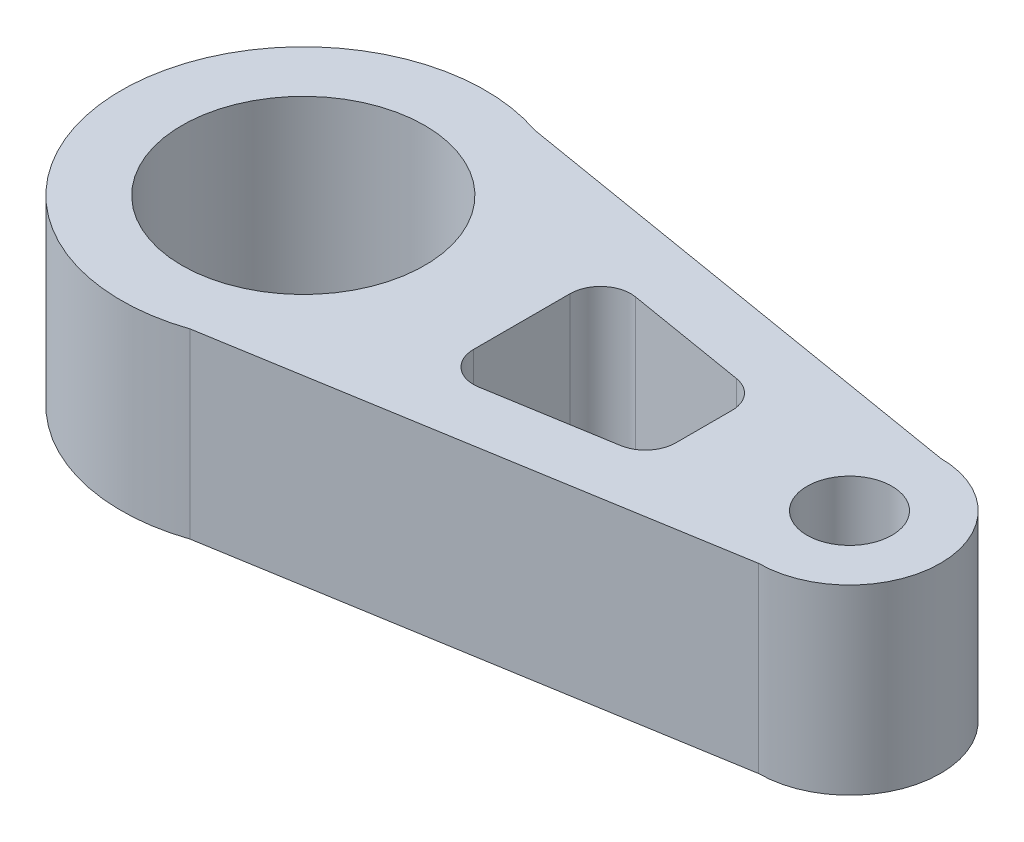
ISO-10303-21;
HEADER;
FILE_DESCRIPTION(('STEP AP214'),'2;1');
FILE_NAME('part.step','',(''),(''),'','','');
FILE_SCHEMA(('AUTOMOTIVE_DESIGN { 1 0 10303 214 1 1 1 1 }'));
ENDSEC;
DATA;
#1=APPLICATION_CONTEXT('core data for automotive mechanical design processes');
#2=APPLICATION_PROTOCOL_DEFINITION('international standard','automotive_design',2000,#1);
#3=PRODUCT_CONTEXT('',#1,'mechanical');
#4=PRODUCT('Part','Part','',(#3));
#5=PRODUCT_RELATED_PRODUCT_CATEGORY('part','',(#4));
#6=PRODUCT_DEFINITION_FORMATION('','',#4);
#7=PRODUCT_DEFINITION_CONTEXT('part definition',#1,'design');
#8=PRODUCT_DEFINITION('design','',#6,#7);
#9=PRODUCT_DEFINITION_SHAPE('','',#8);
#10=(LENGTH_UNIT() NAMED_UNIT(*) SI_UNIT(.MILLI.,.METRE.));
#11=(NAMED_UNIT(*) PLANE_ANGLE_UNIT() SI_UNIT($,.RADIAN.));
#12=(NAMED_UNIT(*) SI_UNIT($,.STERADIAN.) SOLID_ANGLE_UNIT());
#13=UNCERTAINTY_MEASURE_WITH_UNIT(LENGTH_MEASURE(1.E-05),#10,'distance_accuracy_value','');
#14=(GEOMETRIC_REPRESENTATION_CONTEXT(3) GLOBAL_UNCERTAINTY_ASSIGNED_CONTEXT((#13)) GLOBAL_UNIT_ASSIGNED_CONTEXT((#10,
#11,#12)) REPRESENTATION_CONTEXT('',''));
#15=CARTESIAN_POINT('',(0.,0.,0.));
#16=DIRECTION('',(0.,0.,1.));
#17=DIRECTION('',(1.,0.,0.));
#18=AXIS2_PLACEMENT_3D('',#15,#16,#17);
#19=CARTESIAN_POINT('',(57.15,19.05,0.));
#20=DIRECTION('',(0.,-1.,0.));
#21=DIRECTION('',(0.,0.,-1.));
#22=AXIS2_PLACEMENT_3D('',#19,#20,#21);
#23=CYLINDRICAL_SURFACE('',#22,4.445);
#24=CARTESIAN_POINT('',(57.15,19.05,0.));
#25=DIRECTION('',(0.,1.,0.));
#26=DIRECTION('',(0.,0.,1.));
#27=AXIS2_PLACEMENT_3D('',#24,#25,#26);
#28=CIRCLE('',#27,4.445);
#29=CARTESIAN_POINT('',(57.15,19.05,4.445));
#30=VERTEX_POINT('',#29);
#31=EDGE_CURVE('E201',#30,#30,#28,.T.);
#32=ORIENTED_EDGE('',*,*,#31,.T.);
#33=EDGE_LOOP('',(#32));
#34=FACE_BOUND('',#33,.T.);
#35=CARTESIAN_POINT('',(57.15,0.,0.));
#36=DIRECTION('',(0.,1.,0.));
#37=DIRECTION('',(0.,0.,1.));
#38=AXIS2_PLACEMENT_3D('',#35,#36,#37);
#39=CIRCLE('',#38,4.445);
#40=CARTESIAN_POINT('',(57.15,0.,4.445));
#41=VERTEX_POINT('',#40);
#42=EDGE_CURVE('E238',#41,#41,#39,.T.);
#43=ORIENTED_EDGE('',*,*,#42,.F.);
#44=EDGE_LOOP('',(#43));
#45=FACE_BOUND('',#44,.T.);
#46=ADVANCED_FACE('F73',(#34,#45),#23,.F.);
#47=CARTESIAN_POINT('',(3.08918918918919,19.05,18.5351351351351));
#48=DIRECTION('',(-0.164398987305357,0.,-0.986393923832144));
#49=DIRECTION('',(-0.986393923832144,0.,0.164398987305357));
#50=AXIS2_PLACEMENT_3D('',#47,#48,#49);
#51=PLANE('',#50);
#52=DIRECTION('',(0.986393923832144,0.,-0.164398987305357));
#53=VECTOR('',#52,1.);
#54=CARTESIAN_POINT('',(3.08918918918919,0.,18.5351351351351));
#55=LINE('',#54,#53);
#56=CARTESIAN_POINT('',(6.17837837837837,0.,18.0202702702703));
#57=VERTEX_POINT('',#56);
#58=CARTESIAN_POINT('',(57.15,0.,9.52499999999999));
#59=VERTEX_POINT('',#58);
#60=EDGE_CURVE('E193',#57,#59,#55,.T.);
#61=ORIENTED_EDGE('',*,*,#60,.T.);
#62=DIRECTION('',(0.,-1.,0.));
#63=VECTOR('',#62,1.);
#64=CARTESIAN_POINT('',(57.15,19.05,9.52499999999999));
#65=LINE('',#64,#63);
#66=CARTESIAN_POINT('',(57.15,19.05,9.52499999999999));
#67=VERTEX_POINT('',#66);
#68=EDGE_CURVE('E83',#67,#59,#65,.T.);
#69=ORIENTED_EDGE('',*,*,#68,.F.);
#70=DIRECTION('',(0.986393923832144,0.,-0.164398987305357));
#71=VECTOR('',#70,1.);
#72=CARTESIAN_POINT('',(3.08918918918919,19.05,18.5351351351351));
#73=LINE('',#72,#71);
#74=CARTESIAN_POINT('',(6.17837837837837,19.05,18.0202702702703));
#75=VERTEX_POINT('',#74);
#76=EDGE_CURVE('E181',#75,#67,#73,.T.);
#77=ORIENTED_EDGE('',*,*,#76,.F.);
#78=DIRECTION('',(0.,-1.,0.));
#79=VECTOR('',#78,1.);
#80=CARTESIAN_POINT('',(6.17837837837837,19.05,18.0202702702703));
#81=LINE('',#80,#79);
#82=EDGE_CURVE('E12',#75,#57,#81,.T.);
#83=ORIENTED_EDGE('',*,*,#82,.T.);
#84=EDGE_LOOP('',(#61,#69,#77,#83));
#85=FACE_BOUND('',#84,.T.);
#86=ADVANCED_FACE('F191',(#85),#51,.F.);
#87=CARTESIAN_POINT('',(57.15,19.05,0.));
#88=DIRECTION('',(0.,-1.,0.));
#89=DIRECTION('',(0.,0.,-1.));
#90=AXIS2_PLACEMENT_3D('',#87,#88,#89);
#91=CYLINDRICAL_SURFACE('',#90,9.52499999999999);
#92=CARTESIAN_POINT('',(57.15,0.,0.));
#93=DIRECTION('',(0.,1.,0.));
#94=DIRECTION('',(0.,0.,1.));
#95=AXIS2_PLACEMENT_3D('',#92,#93,#94);
#96=CIRCLE('',#95,9.52499999999999);
#97=CARTESIAN_POINT('',(57.15,0.,-9.52499999999999));
#98=VERTEX_POINT('',#97);
#99=EDGE_CURVE('E228',#59,#98,#96,.T.);
#100=ORIENTED_EDGE('',*,*,#99,.T.);
#101=DIRECTION('',(0.,-1.,0.));
#102=VECTOR('',#101,1.);
#103=CARTESIAN_POINT('',(57.15,19.05,-9.52499999999999));
#104=LINE('',#103,#102);
#105=CARTESIAN_POINT('',(57.15,19.05,-9.52499999999999));
#106=VERTEX_POINT('',#105);
#107=EDGE_CURVE('E177',#106,#98,#104,.T.);
#108=ORIENTED_EDGE('',*,*,#107,.F.);
#109=CARTESIAN_POINT('',(57.15,19.05,0.));
#110=DIRECTION('',(0.,1.,0.));
#111=DIRECTION('',(0.,0.,1.));
#112=AXIS2_PLACEMENT_3D('',#109,#110,#111);
#113=CIRCLE('',#112,9.52499999999999);
#114=EDGE_CURVE('E171',#67,#106,#113,.T.);
#115=ORIENTED_EDGE('',*,*,#114,.F.);
#116=ORIENTED_EDGE('',*,*,#68,.T.);
#117=EDGE_LOOP('',(#100,#108,#115,#116));
#118=FACE_BOUND('',#117,.T.);
#119=ADVANCED_FACE('F174',(#118),#91,.T.);
#120=CARTESIAN_POINT('',(3.08918918918919,19.05,-18.5351351351351));
#121=DIRECTION('',(-0.164398987305357,0.,0.986393923832144));
#122=DIRECTION('',(0.986393923832144,0.,0.164398987305357));
#123=AXIS2_PLACEMENT_3D('',#120,#121,#122);
#124=PLANE('',#123);
#125=DIRECTION('',(-0.986393923832144,0.,-0.164398987305357));
#126=VECTOR('',#125,1.);
#127=CARTESIAN_POINT('',(3.08918918918919,0.,-18.5351351351351));
#128=LINE('',#127,#126);
#129=CARTESIAN_POINT('',(6.17837837837837,0.,-18.0202702702703));
#130=VERTEX_POINT('',#129);
#131=EDGE_CURVE('E130',#98,#130,#128,.T.);
#132=ORIENTED_EDGE('',*,*,#131,.T.);
#133=DIRECTION('',(0.,-1.,0.));
#134=VECTOR('',#133,1.);
#135=CARTESIAN_POINT('',(6.17837837837837,19.05,-18.0202702702703));
#136=LINE('',#135,#134);
#137=CARTESIAN_POINT('',(6.17837837837837,19.05,-18.0202702702703));
#138=VERTEX_POINT('',#137);
#139=EDGE_CURVE('E92',#138,#130,#136,.T.);
#140=ORIENTED_EDGE('',*,*,#139,.F.);
#141=DIRECTION('',(-0.986393923832144,0.,-0.164398987305357));
#142=VECTOR('',#141,1.);
#143=CARTESIAN_POINT('',(3.08918918918919,19.05,-18.5351351351351));
#144=LINE('',#143,#142);
#145=EDGE_CURVE('E180',#106,#138,#144,.T.);
#146=ORIENTED_EDGE('',*,*,#145,.F.);
#147=ORIENTED_EDGE('',*,*,#107,.T.);
#148=EDGE_LOOP('',(#132,#140,#146,#147));
#149=FACE_BOUND('',#148,.T.);
#150=ADVANCED_FACE('F308',(#149),#124,.F.);
#151=CARTESIAN_POINT('',(41.91,19.05,0.));
#152=DIRECTION('',(1.,0.,0.));
#153=DIRECTION('',(0.,0.,-1.));
#154=AXIS2_PLACEMENT_3D('',#151,#152,#153);
#155=PLANE('',#154);
#156=DIRECTION('',(0.,0.,1.));
#157=VECTOR('',#156,1.);
#158=CARTESIAN_POINT('',(41.91,0.,0.));
#159=LINE('',#158,#157);
#160=CARTESIAN_POINT('',(41.91,0.,-2.93778114981824));
#161=VERTEX_POINT('',#160);
#162=CARTESIAN_POINT('',(41.91,0.,2.93778114981824));
#163=VERTEX_POINT('',#162);
#164=EDGE_CURVE('E224',#161,#163,#159,.T.);
#165=ORIENTED_EDGE('',*,*,#164,.T.);
#166=DIRECTION('',(0.,-1.,0.));
#167=VECTOR('',#166,1.);
#168=CARTESIAN_POINT('',(41.91,19.05,2.93778114981824));
#169=LINE('',#168,#167);
#170=CARTESIAN_POINT('',(41.91,19.05,2.93778114981824));
#171=VERTEX_POINT('',#170);
#172=EDGE_CURVE('E213',#171,#163,#169,.T.);
#173=ORIENTED_EDGE('',*,*,#172,.F.);
#174=DIRECTION('',(0.,0.,1.));
#175=VECTOR('',#174,1.);
#176=CARTESIAN_POINT('',(41.91,19.05,0.));
#177=LINE('',#176,#175);
#178=CARTESIAN_POINT('',(41.91,19.05,-2.93778114981824));
#179=VERTEX_POINT('',#178);
#180=EDGE_CURVE('E242',#179,#171,#177,.T.);
#181=ORIENTED_EDGE('',*,*,#180,.F.);
#182=DIRECTION('',(0.,-1.,0.));
#183=VECTOR('',#182,1.);
#184=CARTESIAN_POINT('',(41.91,19.05,-2.93778114981824));
#185=LINE('',#184,#183);
#186=EDGE_CURVE('E141',#179,#161,#185,.T.);
#187=ORIENTED_EDGE('',*,*,#186,.T.);
#188=EDGE_LOOP('',(#165,#173,#181,#187));
#189=FACE_BOUND('',#188,.T.);
#190=ADVANCED_FACE('F311',(#189),#155,.F.);
#191=CARTESIAN_POINT('',(38.735,19.05,2.93778114981824));
#192=DIRECTION('',(0.,-1.,0.));
#193=DIRECTION('',(0.,0.,-1.));
#194=AXIS2_PLACEMENT_3D('',#191,#192,#193);
#195=CYLINDRICAL_SURFACE('',#194,3.175);
#196=CARTESIAN_POINT('',(38.735,0.,2.93778114981824));
#197=DIRECTION('',(0.,1.,0.));
#198=DIRECTION('',(0.,0.,1.));
#199=AXIS2_PLACEMENT_3D('',#196,#197,#198);
#200=CIRCLE('',#199,3.175);
#201=CARTESIAN_POINT('',(39.2569667846945,0.,6.06958185798529));
#202=VERTEX_POINT('',#201);
#203=EDGE_CURVE('E264',#163,#202,#200,.F.);
#204=ORIENTED_EDGE('',*,*,#203,.T.);
#205=DIRECTION('',(0.,-1.,0.));
#206=VECTOR('',#205,1.);
#207=CARTESIAN_POINT('',(39.2569667846945,19.05,6.06958185798529));
#208=LINE('',#207,#206);
#209=CARTESIAN_POINT('',(39.2569667846945,19.05,6.06958185798529));
#210=VERTEX_POINT('',#209);
#211=EDGE_CURVE('E210',#210,#202,#208,.T.);
#212=ORIENTED_EDGE('',*,*,#211,.F.);
#213=CARTESIAN_POINT('',(38.735,19.05,2.93778114981824));
#214=DIRECTION('',(0.,1.,0.));
#215=DIRECTION('',(0.,0.,1.));
#216=AXIS2_PLACEMENT_3D('',#213,#214,#215);
#217=CIRCLE('',#216,3.175);
#218=EDGE_CURVE('E245',#171,#210,#217,.F.);
#219=ORIENTED_EDGE('',*,*,#218,.F.);
#220=ORIENTED_EDGE('',*,*,#172,.T.);
#221=EDGE_LOOP('',(#204,#212,#219,#220));
#222=FACE_BOUND('',#221,.T.);
#223=ADVANCED_FACE('F327',(#222),#195,.F.);
#224=CARTESIAN_POINT('',(2.04525561980018,19.05,12.271533718801));
#225=DIRECTION('',(0.164398987305358,0.,0.986393923832144));
#226=DIRECTION('',(0.986393923832144,0.,-0.164398987305358));
#227=AXIS2_PLACEMENT_3D('',#224,#225,#226);
#228=PLANE('',#227);
#229=DIRECTION('',(-0.986393923832144,0.,0.164398987305358));
#230=VECTOR('',#229,1.);
#231=CARTESIAN_POINT('',(2.04525561980018,0.,12.271533718801));
#232=LINE('',#231,#230);
#233=CARTESIAN_POINT('',(26.5569667846945,0.,8.18624852465197));
#234=VERTEX_POINT('',#233);
#235=EDGE_CURVE('E266',#202,#234,#232,.T.);
#236=ORIENTED_EDGE('',*,*,#235,.T.);
#237=DIRECTION('',(0.,-1.,0.));
#238=VECTOR('',#237,1.);
#239=CARTESIAN_POINT('',(26.5569667846945,19.05,8.18624852465197));
#240=LINE('',#239,#238);
#241=CARTESIAN_POINT('',(26.5569667846945,19.05,8.18624852465197));
#242=VERTEX_POINT('',#241);
#243=EDGE_CURVE('E208',#242,#234,#240,.T.);
#244=ORIENTED_EDGE('',*,*,#243,.F.);
#245=DIRECTION('',(-0.986393923832144,0.,0.164398987305358));
#246=VECTOR('',#245,1.);
#247=CARTESIAN_POINT('',(2.04525561980018,19.05,12.271533718801));
#248=LINE('',#247,#246);
#249=EDGE_CURVE('E249',#210,#242,#248,.T.);
#250=ORIENTED_EDGE('',*,*,#249,.F.);
#251=ORIENTED_EDGE('',*,*,#211,.T.);
#252=EDGE_LOOP('',(#236,#244,#250,#251));
#253=FACE_BOUND('',#252,.T.);
#254=ADVANCED_FACE('F323',(#253),#228,.F.);
#255=CARTESIAN_POINT('',(26.035,19.05,5.05444781648491));
#256=DIRECTION('',(0.,-1.,0.));
#257=DIRECTION('',(0.,0.,-1.));
#258=AXIS2_PLACEMENT_3D('',#255,#256,#257);
#259=CYLINDRICAL_SURFACE('',#258,3.175);
#260=CARTESIAN_POINT('',(26.035,0.,5.05444781648491));
#261=DIRECTION('',(0.,1.,0.));
#262=DIRECTION('',(0.,0.,1.));
#263=AXIS2_PLACEMENT_3D('',#260,#261,#262);
#264=CIRCLE('',#263,3.175);
#265=CARTESIAN_POINT('',(22.86,0.,5.05444781648491));
#266=VERTEX_POINT('',#265);
#267=EDGE_CURVE('E269',#266,#234,#264,.T.);
#268=ORIENTED_EDGE('',*,*,#267,.F.);
#269=DIRECTION('',(0.,-1.,0.));
#270=VECTOR('',#269,1.);
#271=CARTESIAN_POINT('',(22.86,19.05,5.05444781648491));
#272=LINE('',#271,#270);
#273=CARTESIAN_POINT('',(22.86,19.05,5.05444781648491));
#274=VERTEX_POINT('',#273);
#275=EDGE_CURVE('E206',#274,#266,#272,.T.);
#276=ORIENTED_EDGE('',*,*,#275,.F.);
#277=CARTESIAN_POINT('',(26.035,19.05,5.05444781648491));
#278=DIRECTION('',(0.,1.,0.));
#279=DIRECTION('',(0.,0.,1.));
#280=AXIS2_PLACEMENT_3D('',#277,#278,#279);
#281=CIRCLE('',#280,3.175);
#282=EDGE_CURVE('E251',#274,#242,#281,.T.);
#283=ORIENTED_EDGE('',*,*,#282,.T.);
#284=ORIENTED_EDGE('',*,*,#243,.T.);
#285=EDGE_LOOP('',(#268,#276,#283,#284));
#286=FACE_BOUND('',#285,.T.);
#287=ADVANCED_FACE('F319',(#286),#259,.F.);
#288=CARTESIAN_POINT('',(22.86,19.05,0.));
#289=DIRECTION('',(1.,0.,0.));
#290=DIRECTION('',(0.,0.,-1.));
#291=AXIS2_PLACEMENT_3D('',#288,#289,#290);
#292=PLANE('',#291);
#293=DIRECTION('',(0.,0.,1.));
#294=VECTOR('',#293,1.);
#295=CARTESIAN_POINT('',(22.86,0.,0.));
#296=LINE('',#295,#294);
#297=CARTESIAN_POINT('',(22.86,0.,-5.05444781648491));
#298=VERTEX_POINT('',#297);
#299=EDGE_CURVE('E272',#298,#266,#296,.T.);
#300=ORIENTED_EDGE('',*,*,#299,.F.);
#301=DIRECTION('',(0.,-1.,0.));
#302=VECTOR('',#301,1.);
#303=CARTESIAN_POINT('',(22.86,19.05,-5.05444781648491));
#304=LINE('',#303,#302);
#305=CARTESIAN_POINT('',(22.86,19.05,-5.05444781648491));
#306=VERTEX_POINT('',#305);
#307=EDGE_CURVE('E204',#306,#298,#304,.T.);
#308=ORIENTED_EDGE('',*,*,#307,.F.);
#309=DIRECTION('',(0.,0.,1.));
#310=VECTOR('',#309,1.);
#311=CARTESIAN_POINT('',(22.86,19.05,0.));
#312=LINE('',#311,#310);
#313=EDGE_CURVE('E254',#306,#274,#312,.T.);
#314=ORIENTED_EDGE('',*,*,#313,.T.);
#315=ORIENTED_EDGE('',*,*,#275,.T.);
#316=EDGE_LOOP('',(#300,#308,#314,#315));
#317=FACE_BOUND('',#316,.T.);
#318=ADVANCED_FACE('F316',(#317),#292,.T.);
#319=CARTESIAN_POINT('',(26.035,19.05,-5.05444781648491));
#320=DIRECTION('',(0.,-1.,0.));
#321=DIRECTION('',(0.,0.,-1.));
#322=AXIS2_PLACEMENT_3D('',#319,#320,#321);
#323=CYLINDRICAL_SURFACE('',#322,3.175);
#324=CARTESIAN_POINT('',(26.035,0.,-5.05444781648491));
#325=DIRECTION('',(0.,1.,0.));
#326=DIRECTION('',(0.,0.,1.));
#327=AXIS2_PLACEMENT_3D('',#324,#325,#326);
#328=CIRCLE('',#327,3.175);
#329=CARTESIAN_POINT('',(26.5569667846945,0.,-8.18624852465197));
#330=VERTEX_POINT('',#329);
#331=EDGE_CURVE('E233',#298,#330,#328,.F.);
#332=ORIENTED_EDGE('',*,*,#331,.T.);
#333=DIRECTION('',(0.,-1.,0.));
#334=VECTOR('',#333,1.);
#335=CARTESIAN_POINT('',(26.5569667846945,19.05,-8.18624852465197));
#336=LINE('',#335,#334);
#337=CARTESIAN_POINT('',(26.5569667846945,19.05,-8.18624852465197));
#338=VERTEX_POINT('',#337);
#339=EDGE_CURVE('E200',#338,#330,#336,.T.);
#340=ORIENTED_EDGE('',*,*,#339,.F.);
#341=CARTESIAN_POINT('',(26.035,19.05,-5.05444781648491));
#342=DIRECTION('',(0.,1.,0.));
#343=DIRECTION('',(0.,0.,1.));
#344=AXIS2_PLACEMENT_3D('',#341,#342,#343);
#345=CIRCLE('',#344,3.175);
#346=EDGE_CURVE('E257',#306,#338,#345,.F.);
#347=ORIENTED_EDGE('',*,*,#346,.F.);
#348=ORIENTED_EDGE('',*,*,#307,.T.);
#349=EDGE_LOOP('',(#332,#340,#347,#348));
#350=FACE_BOUND('',#349,.T.);
#351=ADVANCED_FACE('F277',(#350),#323,.F.);
#352=CARTESIAN_POINT('',(2.04525561980017,19.05,-12.271533718801));
#353=DIRECTION('',(0.164398987305357,0.,-0.986393923832144));
#354=DIRECTION('',(-0.986393923832144,0.,-0.164398987305357));
#355=AXIS2_PLACEMENT_3D('',#352,#353,#354);
#356=PLANE('',#355);
#357=DIRECTION('',(0.986393923832144,0.,0.164398987305357));
#358=VECTOR('',#357,1.);
#359=CARTESIAN_POINT('',(2.04525561980017,0.,-12.271533718801));
#360=LINE('',#359,#358);
#361=CARTESIAN_POINT('',(39.2569667846945,0.,-6.0695818579853));
#362=VERTEX_POINT('',#361);
#363=EDGE_CURVE('E229',#330,#362,#360,.T.);
#364=ORIENTED_EDGE('',*,*,#363,.T.);
#365=DIRECTION('',(0.,-1.,0.));
#366=VECTOR('',#365,1.);
#367=CARTESIAN_POINT('',(39.2569667846945,19.05,-6.0695818579853));
#368=LINE('',#367,#366);
#369=CARTESIAN_POINT('',(39.2569667846945,19.05,-6.0695818579853));
#370=VERTEX_POINT('',#369);
#371=EDGE_CURVE('E198',#370,#362,#368,.T.);
#372=ORIENTED_EDGE('',*,*,#371,.F.);
#373=DIRECTION('',(0.986393923832144,0.,0.164398987305357));
#374=VECTOR('',#373,1.);
#375=CARTESIAN_POINT('',(2.04525561980017,19.05,-12.271533718801));
#376=LINE('',#375,#374);
#377=EDGE_CURVE('E189',#338,#370,#376,.T.);
#378=ORIENTED_EDGE('',*,*,#377,.F.);
#379=ORIENTED_EDGE('',*,*,#339,.T.);
#380=EDGE_LOOP('',(#364,#372,#378,#379));
#381=FACE_BOUND('',#380,.T.);
#382=ADVANCED_FACE('F284',(#381),#356,.F.);
#383=CARTESIAN_POINT('',(38.735,19.05,-2.93778114981824));
#384=DIRECTION('',(0.,-1.,0.));
#385=DIRECTION('',(0.,0.,-1.));
#386=AXIS2_PLACEMENT_3D('',#383,#384,#385);
#387=CYLINDRICAL_SURFACE('',#386,3.175);
#388=CARTESIAN_POINT('',(38.735,0.,-2.93778114981824));
#389=DIRECTION('',(0.,1.,0.));
#390=DIRECTION('',(0.,0.,1.));
#391=AXIS2_PLACEMENT_3D('',#388,#389,#390);
#392=CIRCLE('',#391,3.175);
#393=EDGE_CURVE('E222',#161,#362,#392,.T.);
#394=ORIENTED_EDGE('',*,*,#393,.F.);
#395=ORIENTED_EDGE('',*,*,#186,.F.);
#396=CARTESIAN_POINT('',(38.735,19.05,-2.93778114981824));
#397=DIRECTION('',(0.,1.,0.));
#398=DIRECTION('',(0.,0.,1.));
#399=AXIS2_PLACEMENT_3D('',#396,#397,#398);
#400=CIRCLE('',#399,3.175);
#401=EDGE_CURVE('E240',#179,#370,#400,.T.);
#402=ORIENTED_EDGE('',*,*,#401,.T.);
#403=ORIENTED_EDGE('',*,*,#371,.T.);
#404=EDGE_LOOP('',(#394,#395,#402,#403));
#405=FACE_BOUND('',#404,.T.);
#406=ADVANCED_FACE('F288',(#405),#387,.F.);
#407=CARTESIAN_POINT('',(0.,0.,0.));
#408=DIRECTION('',(0.,1.,0.));
#409=DIRECTION('',(0.,0.,1.));
#410=AXIS2_PLACEMENT_3D('',#407,#408,#409);
#411=PLANE('',#410);
#412=ORIENTED_EDGE('',*,*,#393,.T.);
#413=ORIENTED_EDGE('',*,*,#363,.F.);
#414=ORIENTED_EDGE('',*,*,#331,.F.);
#415=ORIENTED_EDGE('',*,*,#299,.T.);
#416=ORIENTED_EDGE('',*,*,#267,.T.);
#417=ORIENTED_EDGE('',*,*,#235,.F.);
#418=ORIENTED_EDGE('',*,*,#203,.F.);
#419=ORIENTED_EDGE('',*,*,#164,.F.);
#420=EDGE_LOOP('',(#412,#413,#414,#415,#416,#417,#418,#419));
#421=FACE_BOUND('',#420,.T.);
#422=ORIENTED_EDGE('',*,*,#60,.F.);
#423=CARTESIAN_POINT('',(0.,0.,0.));
#424=DIRECTION('',(0.,1.,0.));
#425=DIRECTION('',(0.,0.,1.));
#426=AXIS2_PLACEMENT_3D('',#423,#424,#425);
#427=CIRCLE('',#426,19.05);
#428=EDGE_CURVE('E77',#130,#57,#427,.T.);
#429=ORIENTED_EDGE('',*,*,#428,.F.);
#430=ORIENTED_EDGE('',*,*,#131,.F.);
#431=ORIENTED_EDGE('',*,*,#99,.F.);
#432=EDGE_LOOP('',(#422,#429,#430,#431));
#433=FACE_BOUND('',#432,.T.);
#434=ORIENTED_EDGE('',*,*,#42,.T.);
#435=EDGE_LOOP('',(#434));
#436=FACE_BOUND('',#435,.T.);
#437=CARTESIAN_POINT('',(0.,0.,0.));
#438=DIRECTION('',(0.,1.,0.));
#439=DIRECTION('',(0.,0.,1.));
#440=AXIS2_PLACEMENT_3D('',#437,#438,#439);
#441=CIRCLE('',#440,12.7);
#442=CARTESIAN_POINT('',(0.,0.,12.7));
#443=VERTEX_POINT('',#442);
#444=EDGE_CURVE('E220',#443,#443,#441,.T.);
#445=ORIENTED_EDGE('',*,*,#444,.T.);
#446=EDGE_LOOP('',(#445));
#447=FACE_BOUND('',#446,.T.);
#448=ADVANCED_FACE('F226',(#421,#433,#436,#447),#411,.F.);
#449=CARTESIAN_POINT('',(0.,19.05,0.));
#450=DIRECTION('',(0.,1.,0.));
#451=DIRECTION('',(0.,0.,1.));
#452=AXIS2_PLACEMENT_3D('',#449,#450,#451);
#453=PLANE('',#452);
#454=ORIENTED_EDGE('',*,*,#401,.F.);
#455=ORIENTED_EDGE('',*,*,#180,.T.);
#456=ORIENTED_EDGE('',*,*,#218,.T.);
#457=ORIENTED_EDGE('',*,*,#249,.T.);
#458=ORIENTED_EDGE('',*,*,#282,.F.);
#459=ORIENTED_EDGE('',*,*,#313,.F.);
#460=ORIENTED_EDGE('',*,*,#346,.T.);
#461=ORIENTED_EDGE('',*,*,#377,.T.);
#462=EDGE_LOOP('',(#454,#455,#456,#457,#458,#459,#460,#461));
#463=FACE_BOUND('',#462,.T.);
#464=ORIENTED_EDGE('',*,*,#145,.T.);
#465=CARTESIAN_POINT('',(0.,19.05,0.));
#466=DIRECTION('',(0.,1.,0.));
#467=DIRECTION('',(0.,0.,1.));
#468=AXIS2_PLACEMENT_3D('',#465,#466,#467);
#469=CIRCLE('',#468,19.05);
#470=EDGE_CURVE('E187',#138,#75,#469,.T.);
#471=ORIENTED_EDGE('',*,*,#470,.T.);
#472=ORIENTED_EDGE('',*,*,#76,.T.);
#473=ORIENTED_EDGE('',*,*,#114,.T.);
#474=EDGE_LOOP('',(#464,#471,#472,#473));
#475=FACE_BOUND('',#474,.T.);
#476=ORIENTED_EDGE('',*,*,#31,.F.);
#477=EDGE_LOOP('',(#476));
#478=FACE_BOUND('',#477,.T.);
#479=CARTESIAN_POINT('',(0.,19.05,0.));
#480=DIRECTION('',(0.,1.,0.));
#481=DIRECTION('',(0.,0.,1.));
#482=AXIS2_PLACEMENT_3D('',#479,#480,#481);
#483=CIRCLE('',#482,12.7);
#484=CARTESIAN_POINT('',(0.,19.05,12.7));
#485=VERTEX_POINT('',#484);
#486=EDGE_CURVE('E217',#485,#485,#483,.T.);
#487=ORIENTED_EDGE('',*,*,#486,.F.);
#488=EDGE_LOOP('',(#487));
#489=FACE_BOUND('',#488,.T.);
#490=ADVANCED_FACE('F185',(#463,#475,#478,#489),#453,.T.);
#491=CARTESIAN_POINT('',(0.,19.05,0.));
#492=DIRECTION('',(0.,-1.,0.));
#493=DIRECTION('',(0.,0.,-1.));
#494=AXIS2_PLACEMENT_3D('',#491,#492,#493);
#495=CYLINDRICAL_SURFACE('',#494,12.7);
#496=ORIENTED_EDGE('',*,*,#486,.T.);
#497=EDGE_LOOP('',(#496));
#498=FACE_BOUND('',#497,.T.);
#499=ORIENTED_EDGE('',*,*,#444,.F.);
#500=EDGE_LOOP('',(#499));
#501=FACE_BOUND('',#500,.T.);
#502=ADVANCED_FACE('F346',(#498,#501),#495,.F.);
#503=CARTESIAN_POINT('',(0.,19.05,0.));
#504=DIRECTION('',(0.,-1.,0.));
#505=DIRECTION('',(0.,0.,-1.));
#506=AXIS2_PLACEMENT_3D('',#503,#504,#505);
#507=CYLINDRICAL_SURFACE('',#506,19.05);
#508=ORIENTED_EDGE('',*,*,#428,.T.);
#509=ORIENTED_EDGE('',*,*,#82,.F.);
#510=ORIENTED_EDGE('',*,*,#470,.F.);
#511=ORIENTED_EDGE('',*,*,#139,.T.);
#512=EDGE_LOOP('',(#508,#509,#510,#511));
#513=FACE_BOUND('',#512,.T.);
#514=ADVANCED_FACE('F75',(#513),#507,.T.);
#515=CLOSED_SHELL('',(#46,#86,#119,#150,#190,#223,#254,#287,#318,#351,#382,#406,#448,#490,#502,#514));
#516=MANIFOLD_SOLID_BREP('B2',#515);
#517=ADVANCED_BREP_SHAPE_REPRESENTATION('',(#18,#516),#14);
#518=SHAPE_DEFINITION_REPRESENTATION(#9,#517);
ENDSEC;
END-ISO-10303-21;
